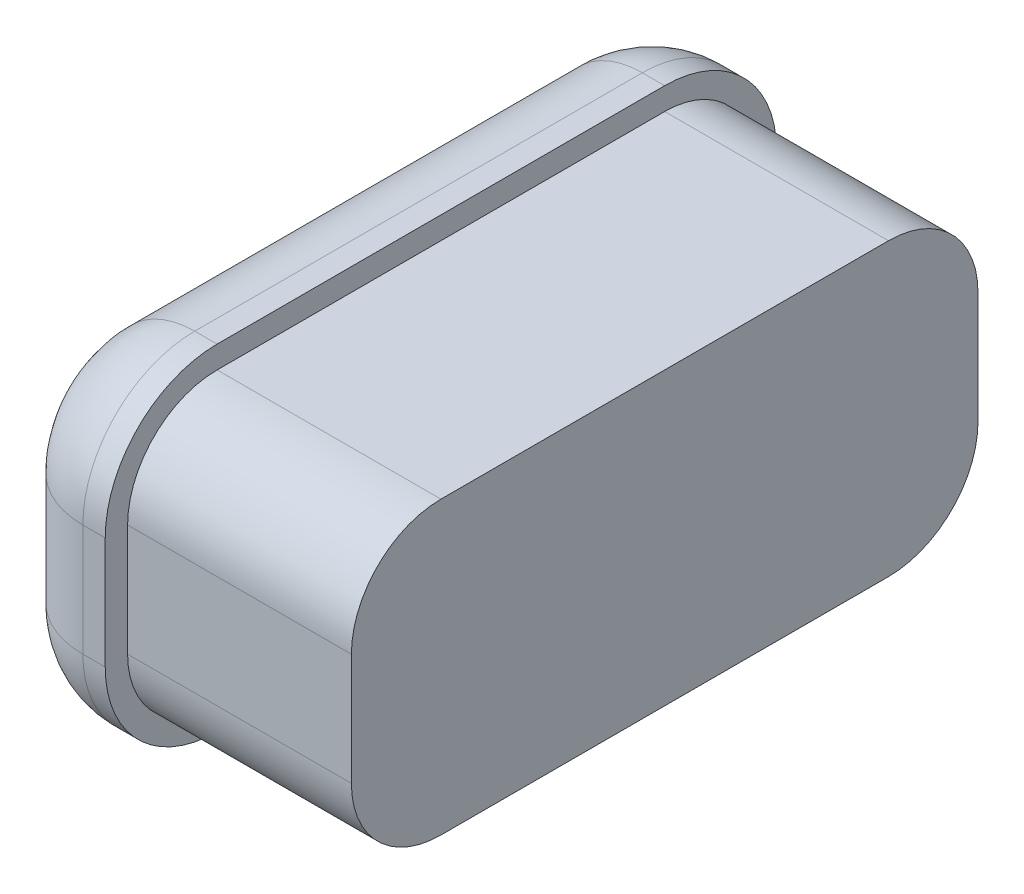
ISO-10303-21;
HEADER;
FILE_DESCRIPTION(('STEP AP214'),'2;1');
FILE_NAME('part.step','',(''),(''),'','','');
FILE_SCHEMA(('AUTOMOTIVE_DESIGN { 1 0 10303 214 1 1 1 1 }'));
ENDSEC;
DATA;
#1=APPLICATION_CONTEXT('core data for automotive mechanical design processes');
#2=APPLICATION_PROTOCOL_DEFINITION('international standard','automotive_design',2000,#1);
#3=PRODUCT_CONTEXT('',#1,'mechanical');
#4=PRODUCT('Part','Part','',(#3));
#5=PRODUCT_RELATED_PRODUCT_CATEGORY('part','',(#4));
#6=PRODUCT_DEFINITION_FORMATION('','',#4);
#7=PRODUCT_DEFINITION_CONTEXT('part definition',#1,'design');
#8=PRODUCT_DEFINITION('design','',#6,#7);
#9=PRODUCT_DEFINITION_SHAPE('','',#8);
#10=(LENGTH_UNIT() NAMED_UNIT(*) SI_UNIT(.MILLI.,.METRE.));
#11=(NAMED_UNIT(*) PLANE_ANGLE_UNIT() SI_UNIT($,.RADIAN.));
#12=(NAMED_UNIT(*) SI_UNIT($,.STERADIAN.) SOLID_ANGLE_UNIT());
#13=UNCERTAINTY_MEASURE_WITH_UNIT(LENGTH_MEASURE(1.E-05),#10,'distance_accuracy_value','');
#14=(GEOMETRIC_REPRESENTATION_CONTEXT(3) GLOBAL_UNCERTAINTY_ASSIGNED_CONTEXT((#13)) GLOBAL_UNIT_ASSIGNED_CONTEXT((#10,
#11,#12)) REPRESENTATION_CONTEXT('',''));
#15=CARTESIAN_POINT('',(0.,0.,0.));
#16=DIRECTION('',(0.,0.,1.));
#17=DIRECTION('',(1.,0.,0.));
#18=AXIS2_PLACEMENT_3D('',#15,#16,#17);
#19=CARTESIAN_POINT('',(5.,-7.5,15.));
#20=DIRECTION('',(0.,0.,-1.));
#21=DIRECTION('',(-1.,0.,0.));
#22=AXIS2_PLACEMENT_3D('',#19,#20,#21);
#23=PLANE('',#22);
#24=DIRECTION('',(-1.,0.,0.));
#25=VECTOR('',#24,1.);
#26=CARTESIAN_POINT('',(5.,2.5,15.));
#27=LINE('',#26,#25);
#28=CARTESIAN_POINT('',(5.,2.5,15.));
#29=VERTEX_POINT('',#28);
#30=CARTESIAN_POINT('',(4.,2.5,15.));
#31=VERTEX_POINT('',#30);
#32=EDGE_CURVE('E274',#29,#31,#27,.T.);
#33=ORIENTED_EDGE('',*,*,#32,.T.);
#34=DIRECTION('',(0.,-1.,0.));
#35=VECTOR('',#34,1.);
#36=CARTESIAN_POINT('',(4.,-7.5,15.));
#37=LINE('',#36,#35);
#38=CARTESIAN_POINT('',(4.,-2.5,15.));
#39=VERTEX_POINT('',#38);
#40=EDGE_CURVE('E299',#31,#39,#37,.T.);
#41=ORIENTED_EDGE('',*,*,#40,.T.);
#42=DIRECTION('',(-1.,0.,0.));
#43=VECTOR('',#42,1.);
#44=CARTESIAN_POINT('',(5.,-2.5,15.));
#45=LINE('',#44,#43);
#46=CARTESIAN_POINT('',(5.,-2.5,15.));
#47=VERTEX_POINT('',#46);
#48=EDGE_CURVE('E277',#39,#47,#45,.F.);
#49=ORIENTED_EDGE('',*,*,#48,.T.);
#50=DIRECTION('',(0.,-1.,0.));
#51=VECTOR('',#50,1.);
#52=CARTESIAN_POINT('',(5.,-7.5,15.));
#53=LINE('',#52,#51);
#54=EDGE_CURVE('E214',#29,#47,#53,.T.);
#55=ORIENTED_EDGE('',*,*,#54,.F.);
#56=EDGE_LOOP('',(#33,#41,#49,#55));
#57=FACE_BOUND('',#56,.T.);
#58=ADVANCED_FACE('F37',(#57),#23,.F.);
#59=CARTESIAN_POINT('',(5.,-7.5,-15.));
#60=DIRECTION('',(0.,1.,0.));
#61=DIRECTION('',(0.,0.,1.));
#62=AXIS2_PLACEMENT_3D('',#59,#60,#61);
#63=PLANE('',#62);
#64=DIRECTION('',(-1.,0.,0.));
#65=VECTOR('',#64,1.);
#66=CARTESIAN_POINT('',(5.,-7.5,10.));
#67=LINE('',#66,#65);
#68=CARTESIAN_POINT('',(5.,-7.5,10.));
#69=VERTEX_POINT('',#68);
#70=CARTESIAN_POINT('',(4.,-7.5,10.));
#71=VERTEX_POINT('',#70);
#72=EDGE_CURVE('E269',#69,#71,#67,.T.);
#73=ORIENTED_EDGE('',*,*,#72,.T.);
#74=DIRECTION('',(0.,0.,-1.));
#75=VECTOR('',#74,1.);
#76=CARTESIAN_POINT('',(4.,-7.5,-15.));
#77=LINE('',#76,#75);
#78=CARTESIAN_POINT('',(4.,-7.5,-10.));
#79=VERTEX_POINT('',#78);
#80=EDGE_CURVE('E303',#71,#79,#77,.T.);
#81=ORIENTED_EDGE('',*,*,#80,.T.);
#82=DIRECTION('',(-1.,0.,0.));
#83=VECTOR('',#82,1.);
#84=CARTESIAN_POINT('',(5.,-7.5,-10.));
#85=LINE('',#84,#83);
#86=CARTESIAN_POINT('',(5.,-7.5,-10.));
#87=VERTEX_POINT('',#86);
#88=EDGE_CURVE('E272',#79,#87,#85,.F.);
#89=ORIENTED_EDGE('',*,*,#88,.T.);
#90=DIRECTION('',(0.,0.,-1.));
#91=VECTOR('',#90,1.);
#92=CARTESIAN_POINT('',(5.,-7.5,-15.));
#93=LINE('',#92,#91);
#94=EDGE_CURVE('E217',#69,#87,#93,.T.);
#95=ORIENTED_EDGE('',*,*,#94,.F.);
#96=EDGE_LOOP('',(#73,#81,#89,#95));
#97=FACE_BOUND('',#96,.T.);
#98=ADVANCED_FACE('F377',(#97),#63,.F.);
#99=CARTESIAN_POINT('',(5.,-7.5,-15.));
#100=DIRECTION('',(0.,0.,1.));
#101=DIRECTION('',(1.,0.,0.));
#102=AXIS2_PLACEMENT_3D('',#99,#100,#101);
#103=PLANE('',#102);
#104=DIRECTION('',(-1.,0.,0.));
#105=VECTOR('',#104,1.);
#106=CARTESIAN_POINT('',(5.,-2.5,-15.));
#107=LINE('',#106,#105);
#108=CARTESIAN_POINT('',(5.,-2.5,-15.));
#109=VERTEX_POINT('',#108);
#110=CARTESIAN_POINT('',(4.,-2.5,-15.));
#111=VERTEX_POINT('',#110);
#112=EDGE_CURVE('E257',#109,#111,#107,.T.);
#113=ORIENTED_EDGE('',*,*,#112,.T.);
#114=DIRECTION('',(0.,1.,0.));
#115=VECTOR('',#114,1.);
#116=CARTESIAN_POINT('',(4.,-7.5,-15.));
#117=LINE('',#116,#115);
#118=CARTESIAN_POINT('',(4.,2.5,-15.));
#119=VERTEX_POINT('',#118);
#120=EDGE_CURVE('E61',#111,#119,#117,.T.);
#121=ORIENTED_EDGE('',*,*,#120,.T.);
#122=DIRECTION('',(-1.,0.,0.));
#123=VECTOR('',#122,1.);
#124=CARTESIAN_POINT('',(5.,2.5,-15.));
#125=LINE('',#124,#123);
#126=CARTESIAN_POINT('',(5.,2.5,-15.));
#127=VERTEX_POINT('',#126);
#128=EDGE_CURVE('E259',#119,#127,#125,.F.);
#129=ORIENTED_EDGE('',*,*,#128,.T.);
#130=DIRECTION('',(0.,1.,0.));
#131=VECTOR('',#130,1.);
#132=CARTESIAN_POINT('',(5.,-7.5,-15.));
#133=LINE('',#132,#131);
#134=EDGE_CURVE('E221',#109,#127,#133,.T.);
#135=ORIENTED_EDGE('',*,*,#134,.F.);
#136=EDGE_LOOP('',(#113,#121,#129,#135));
#137=FACE_BOUND('',#136,.T.);
#138=ADVANCED_FACE('F383',(#137),#103,.F.);
#139=CARTESIAN_POINT('',(5.,7.5,-15.));
#140=DIRECTION('',(0.,-1.,0.));
#141=DIRECTION('',(0.,0.,-1.));
#142=AXIS2_PLACEMENT_3D('',#139,#140,#141);
#143=PLANE('',#142);
#144=DIRECTION('',(-1.,0.,0.));
#145=VECTOR('',#144,1.);
#146=CARTESIAN_POINT('',(5.,7.5,-10.));
#147=LINE('',#146,#145);
#148=CARTESIAN_POINT('',(5.,7.5,-10.));
#149=VERTEX_POINT('',#148);
#150=CARTESIAN_POINT('',(4.,7.5,-10.));
#151=VERTEX_POINT('',#150);
#152=EDGE_CURVE('E255',#149,#151,#147,.T.);
#153=ORIENTED_EDGE('',*,*,#152,.T.);
#154=DIRECTION('',(0.,0.,1.));
#155=VECTOR('',#154,1.);
#156=CARTESIAN_POINT('',(4.,7.5,-15.));
#157=LINE('',#156,#155);
#158=CARTESIAN_POINT('',(4.,7.5,10.));
#159=VERTEX_POINT('',#158);
#160=EDGE_CURVE('E11',#151,#159,#157,.T.);
#161=ORIENTED_EDGE('',*,*,#160,.T.);
#162=DIRECTION('',(-1.,0.,0.));
#163=VECTOR('',#162,1.);
#164=CARTESIAN_POINT('',(5.,7.5,10.));
#165=LINE('',#164,#163);
#166=CARTESIAN_POINT('',(5.,7.5,10.));
#167=VERTEX_POINT('',#166);
#168=EDGE_CURVE('E253',#159,#167,#165,.F.);
#169=ORIENTED_EDGE('',*,*,#168,.T.);
#170=DIRECTION('',(0.,0.,1.));
#171=VECTOR('',#170,1.);
#172=CARTESIAN_POINT('',(5.,7.5,-15.));
#173=LINE('',#172,#171);
#174=EDGE_CURVE('E224',#149,#167,#173,.T.);
#175=ORIENTED_EDGE('',*,*,#174,.F.);
#176=EDGE_LOOP('',(#153,#161,#169,#175));
#177=FACE_BOUND('',#176,.T.);
#178=ADVANCED_FACE('F453',(#177),#143,.F.);
#179=CARTESIAN_POINT('',(5.,0.,0.));
#180=DIRECTION('',(1.,0.,0.));
#181=DIRECTION('',(0.,0.,-1.));
#182=AXIS2_PLACEMENT_3D('',#179,#180,#181);
#183=PLANE('',#182);
#184=DIRECTION('',(0.,-1.,0.));
#185=VECTOR('',#184,1.);
#186=CARTESIAN_POINT('',(5.,-6.5,14.));
#187=LINE('',#186,#185);
#188=CARTESIAN_POINT('',(5.,2.5,14.));
#189=VERTEX_POINT('',#188);
#190=CARTESIAN_POINT('',(5.,-2.5,14.));
#191=VERTEX_POINT('',#190);
#192=EDGE_CURVE('E210',#189,#191,#187,.T.);
#193=ORIENTED_EDGE('',*,*,#192,.F.);
#194=CARTESIAN_POINT('',(5.,2.5,10.));
#195=DIRECTION('',(1.,0.,0.));
#196=DIRECTION('',(0.,0.,-1.));
#197=AXIS2_PLACEMENT_3D('',#194,#195,#196);
#198=CIRCLE('',#197,4.);
#199=CARTESIAN_POINT('',(5.,6.5,10.));
#200=VERTEX_POINT('',#199);
#201=EDGE_CURVE('E251',#189,#200,#198,.F.);
#202=ORIENTED_EDGE('',*,*,#201,.T.);
#203=DIRECTION('',(0.,0.,1.));
#204=VECTOR('',#203,1.);
#205=CARTESIAN_POINT('',(5.,6.5,-14.));
#206=LINE('',#205,#204);
#207=CARTESIAN_POINT('',(5.,6.5,-10.));
#208=VERTEX_POINT('',#207);
#209=EDGE_CURVE('E204',#208,#200,#206,.T.);
#210=ORIENTED_EDGE('',*,*,#209,.F.);
#211=CARTESIAN_POINT('',(5.,2.5,-10.));
#212=DIRECTION('',(1.,0.,0.));
#213=DIRECTION('',(0.,0.,-1.));
#214=AXIS2_PLACEMENT_3D('',#211,#212,#213);
#215=CIRCLE('',#214,4.);
#216=CARTESIAN_POINT('',(5.,2.5,-14.));
#217=VERTEX_POINT('',#216);
#218=EDGE_CURVE('E186',#208,#217,#215,.F.);
#219=ORIENTED_EDGE('',*,*,#218,.T.);
#220=DIRECTION('',(0.,1.,0.));
#221=VECTOR('',#220,1.);
#222=CARTESIAN_POINT('',(5.,-6.5,-14.));
#223=LINE('',#222,#221);
#224=CARTESIAN_POINT('',(5.,-2.5,-14.));
#225=VERTEX_POINT('',#224);
#226=EDGE_CURVE('E193',#225,#217,#223,.T.);
#227=ORIENTED_EDGE('',*,*,#226,.F.);
#228=CARTESIAN_POINT('',(5.,-2.5,-10.));
#229=DIRECTION('',(1.,0.,0.));
#230=DIRECTION('',(0.,0.,-1.));
#231=AXIS2_PLACEMENT_3D('',#228,#229,#230);
#232=CIRCLE('',#231,4.);
#233=CARTESIAN_POINT('',(5.,-6.5,-10.));
#234=VERTEX_POINT('',#233);
#235=EDGE_CURVE('E176',#225,#234,#232,.F.);
#236=ORIENTED_EDGE('',*,*,#235,.T.);
#237=DIRECTION('',(0.,0.,-1.));
#238=VECTOR('',#237,1.);
#239=CARTESIAN_POINT('',(5.,-6.5,-14.));
#240=LINE('',#239,#238);
#241=CARTESIAN_POINT('',(5.,-6.5,10.));
#242=VERTEX_POINT('',#241);
#243=EDGE_CURVE('E205',#242,#234,#240,.T.);
#244=ORIENTED_EDGE('',*,*,#243,.F.);
#245=CARTESIAN_POINT('',(5.,-2.5,10.));
#246=DIRECTION('',(1.,0.,0.));
#247=DIRECTION('',(0.,0.,-1.));
#248=AXIS2_PLACEMENT_3D('',#245,#246,#247);
#249=CIRCLE('',#248,4.);
#250=EDGE_CURVE('E249',#242,#191,#249,.F.);
#251=ORIENTED_EDGE('',*,*,#250,.T.);
#252=EDGE_LOOP('',(#193,#202,#210,#219,#227,#236,#244,#251));
#253=FACE_BOUND('',#252,.T.);
#254=ORIENTED_EDGE('',*,*,#134,.T.);
#255=CARTESIAN_POINT('',(5.,2.5,-10.));
#256=DIRECTION('',(1.,0.,0.));
#257=DIRECTION('',(0.,0.,-1.));
#258=AXIS2_PLACEMENT_3D('',#255,#256,#257);
#259=CIRCLE('',#258,5.);
#260=EDGE_CURVE('E267',#127,#149,#259,.T.);
#261=ORIENTED_EDGE('',*,*,#260,.T.);
#262=ORIENTED_EDGE('',*,*,#174,.T.);
#263=CARTESIAN_POINT('',(5.,2.5,10.));
#264=DIRECTION('',(1.,0.,0.));
#265=DIRECTION('',(0.,0.,-1.));
#266=AXIS2_PLACEMENT_3D('',#263,#264,#265);
#267=CIRCLE('',#266,5.);
#268=EDGE_CURVE('E261',#167,#29,#267,.T.);
#269=ORIENTED_EDGE('',*,*,#268,.T.);
#270=ORIENTED_EDGE('',*,*,#54,.T.);
#271=CARTESIAN_POINT('',(5.,-2.5,10.));
#272=DIRECTION('',(1.,0.,0.));
#273=DIRECTION('',(0.,0.,-1.));
#274=AXIS2_PLACEMENT_3D('',#271,#272,#273);
#275=CIRCLE('',#274,5.);
#276=EDGE_CURVE('E263',#47,#69,#275,.T.);
#277=ORIENTED_EDGE('',*,*,#276,.T.);
#278=ORIENTED_EDGE('',*,*,#94,.T.);
#279=CARTESIAN_POINT('',(5.,-2.5,-10.));
#280=DIRECTION('',(1.,0.,0.));
#281=DIRECTION('',(0.,0.,-1.));
#282=AXIS2_PLACEMENT_3D('',#279,#280,#281);
#283=CIRCLE('',#282,5.);
#284=EDGE_CURVE('E265',#87,#109,#283,.T.);
#285=ORIENTED_EDGE('',*,*,#284,.T.);
#286=EDGE_LOOP('',(#254,#261,#262,#269,#270,#277,#278,#285));
#287=FACE_BOUND('',#286,.T.);
#288=ADVANCED_FACE('F201',(#253,#287),#183,.T.);
#289=CARTESIAN_POINT('',(0.,0.,0.));
#290=DIRECTION('',(1.,0.,0.));
#291=DIRECTION('',(0.,0.,-1.));
#292=AXIS2_PLACEMENT_3D('',#289,#290,#291);
#293=PLANE('',#292);
#294=DIRECTION('',(0.,-1.,0.));
#295=VECTOR('',#294,1.);
#296=CARTESIAN_POINT('',(0.,0.,11.));
#297=LINE('',#296,#295);
#298=CARTESIAN_POINT('',(0.,-2.5,11.));
#299=VERTEX_POINT('',#298);
#300=CARTESIAN_POINT('',(0.,2.5,11.));
#301=VERTEX_POINT('',#300);
#302=EDGE_CURVE('E291',#299,#301,#297,.F.);
#303=ORIENTED_EDGE('',*,*,#302,.T.);
#304=CARTESIAN_POINT('',(0.,2.5,10.));
#305=DIRECTION('',(1.,0.,0.));
#306=DIRECTION('',(0.,0.,-1.));
#307=AXIS2_PLACEMENT_3D('',#304,#305,#306);
#308=CIRCLE('',#307,1.);
#309=CARTESIAN_POINT('',(0.,3.5,10.));
#310=VERTEX_POINT('',#309);
#311=EDGE_CURVE('E293',#301,#310,#308,.F.);
#312=ORIENTED_EDGE('',*,*,#311,.T.);
#313=DIRECTION('',(0.,0.,1.));
#314=VECTOR('',#313,1.);
#315=CARTESIAN_POINT('',(0.,3.5,0.));
#316=LINE('',#315,#314);
#317=CARTESIAN_POINT('',(0.,3.5,-10.));
#318=VERTEX_POINT('',#317);
#319=EDGE_CURVE('E279',#310,#318,#316,.F.);
#320=ORIENTED_EDGE('',*,*,#319,.T.);
#321=CARTESIAN_POINT('',(0.,2.5,-10.));
#322=DIRECTION('',(1.,0.,0.));
#323=DIRECTION('',(0.,0.,-1.));
#324=AXIS2_PLACEMENT_3D('',#321,#322,#323);
#325=CIRCLE('',#324,1.);
#326=CARTESIAN_POINT('',(0.,2.5,-11.));
#327=VERTEX_POINT('',#326);
#328=EDGE_CURVE('E281',#318,#327,#325,.F.);
#329=ORIENTED_EDGE('',*,*,#328,.T.);
#330=DIRECTION('',(0.,1.,0.));
#331=VECTOR('',#330,1.);
#332=CARTESIAN_POINT('',(0.,0.,-11.));
#333=LINE('',#332,#331);
#334=CARTESIAN_POINT('',(0.,-2.5,-11.));
#335=VERTEX_POINT('',#334);
#336=EDGE_CURVE('E283',#327,#335,#333,.F.);
#337=ORIENTED_EDGE('',*,*,#336,.T.);
#338=CARTESIAN_POINT('',(0.,-2.5,-10.));
#339=DIRECTION('',(1.,0.,0.));
#340=DIRECTION('',(0.,0.,-1.));
#341=AXIS2_PLACEMENT_3D('',#338,#339,#340);
#342=CIRCLE('',#341,1.);
#343=CARTESIAN_POINT('',(0.,-3.5,-10.));
#344=VERTEX_POINT('',#343);
#345=EDGE_CURVE('E285',#335,#344,#342,.F.);
#346=ORIENTED_EDGE('',*,*,#345,.T.);
#347=DIRECTION('',(0.,0.,-1.));
#348=VECTOR('',#347,1.);
#349=CARTESIAN_POINT('',(0.,-3.5,0.));
#350=LINE('',#349,#348);
#351=CARTESIAN_POINT('',(0.,-3.5,10.));
#352=VERTEX_POINT('',#351);
#353=EDGE_CURVE('E287',#344,#352,#350,.F.);
#354=ORIENTED_EDGE('',*,*,#353,.T.);
#355=CARTESIAN_POINT('',(0.,-2.5,10.));
#356=DIRECTION('',(1.,0.,0.));
#357=DIRECTION('',(0.,0.,-1.));
#358=AXIS2_PLACEMENT_3D('',#355,#356,#357);
#359=CIRCLE('',#358,1.);
#360=EDGE_CURVE('E289',#352,#299,#359,.F.);
#361=ORIENTED_EDGE('',*,*,#360,.T.);
#362=EDGE_LOOP('',(#303,#312,#320,#329,#337,#346,#354,#361));
#363=FACE_BOUND('',#362,.T.);
#364=ADVANCED_FACE('F366',(#363),#293,.F.);
#365=CARTESIAN_POINT('',(15.,-6.5,14.));
#366=DIRECTION('',(0.,0.,-1.));
#367=DIRECTION('',(-1.,0.,0.));
#368=AXIS2_PLACEMENT_3D('',#365,#366,#367);
#369=PLANE('',#368);
#370=ORIENTED_EDGE('',*,*,#192,.T.);
#371=DIRECTION('',(-1.,0.,0.));
#372=VECTOR('',#371,1.);
#373=CARTESIAN_POINT('',(15.,-2.5,14.));
#374=LINE('',#373,#372);
#375=CARTESIAN_POINT('',(15.,-2.5,14.));
#376=VERTEX_POINT('',#375);
#377=EDGE_CURVE('E187',#191,#376,#374,.F.);
#378=ORIENTED_EDGE('',*,*,#377,.T.);
#379=DIRECTION('',(0.,-1.,0.));
#380=VECTOR('',#379,1.);
#381=CARTESIAN_POINT('',(15.,-6.5,14.));
#382=LINE('',#381,#380);
#383=CARTESIAN_POINT('',(15.,2.5,14.));
#384=VERTEX_POINT('',#383);
#385=EDGE_CURVE('E208',#384,#376,#382,.T.);
#386=ORIENTED_EDGE('',*,*,#385,.F.);
#387=DIRECTION('',(-1.,0.,0.));
#388=VECTOR('',#387,1.);
#389=CARTESIAN_POINT('',(15.,2.5,14.));
#390=LINE('',#389,#388);
#391=EDGE_CURVE('E244',#384,#189,#390,.T.);
#392=ORIENTED_EDGE('',*,*,#391,.T.);
#393=EDGE_LOOP('',(#370,#378,#386,#392));
#394=FACE_BOUND('',#393,.T.);
#395=ADVANCED_FACE('F364',(#394),#369,.F.);
#396=CARTESIAN_POINT('',(15.,-6.5,-14.));
#397=DIRECTION('',(0.,1.,0.));
#398=DIRECTION('',(0.,0.,1.));
#399=AXIS2_PLACEMENT_3D('',#396,#397,#398);
#400=PLANE('',#399);
#401=ORIENTED_EDGE('',*,*,#243,.T.);
#402=DIRECTION('',(-1.,0.,0.));
#403=VECTOR('',#402,1.);
#404=CARTESIAN_POINT('',(15.,-6.5,-10.));
#405=LINE('',#404,#403);
#406=CARTESIAN_POINT('',(15.,-6.5,-10.));
#407=VERTEX_POINT('',#406);
#408=EDGE_CURVE('E181',#234,#407,#405,.F.);
#409=ORIENTED_EDGE('',*,*,#408,.T.);
#410=DIRECTION('',(0.,0.,-1.));
#411=VECTOR('',#410,1.);
#412=CARTESIAN_POINT('',(15.,-6.5,-14.));
#413=LINE('',#412,#411);
#414=CARTESIAN_POINT('',(15.,-6.5,10.));
#415=VERTEX_POINT('',#414);
#416=EDGE_CURVE('E341',#415,#407,#413,.T.);
#417=ORIENTED_EDGE('',*,*,#416,.F.);
#418=DIRECTION('',(-1.,0.,0.));
#419=VECTOR('',#418,1.);
#420=CARTESIAN_POINT('',(15.,-6.5,10.));
#421=LINE('',#420,#419);
#422=EDGE_CURVE('E197',#415,#242,#421,.T.);
#423=ORIENTED_EDGE('',*,*,#422,.T.);
#424=EDGE_LOOP('',(#401,#409,#417,#423));
#425=FACE_BOUND('',#424,.T.);
#426=ADVANCED_FACE('F356',(#425),#400,.F.);
#427=CARTESIAN_POINT('',(15.,-6.5,-14.));
#428=DIRECTION('',(0.,0.,1.));
#429=DIRECTION('',(1.,0.,0.));
#430=AXIS2_PLACEMENT_3D('',#427,#428,#429);
#431=PLANE('',#430);
#432=DIRECTION('',(0.,1.,0.));
#433=VECTOR('',#432,1.);
#434=CARTESIAN_POINT('',(15.,-6.5,-14.));
#435=LINE('',#434,#433);
#436=CARTESIAN_POINT('',(15.,-2.5,-14.));
#437=VERTEX_POINT('',#436);
#438=CARTESIAN_POINT('',(15.,2.5,-14.));
#439=VERTEX_POINT('',#438);
#440=EDGE_CURVE('E196',#437,#439,#435,.T.);
#441=ORIENTED_EDGE('',*,*,#440,.F.);
#442=DIRECTION('',(-1.,0.,0.));
#443=VECTOR('',#442,1.);
#444=CARTESIAN_POINT('',(15.,-2.5,-14.));
#445=LINE('',#444,#443);
#446=EDGE_CURVE('E180',#437,#225,#445,.T.);
#447=ORIENTED_EDGE('',*,*,#446,.T.);
#448=ORIENTED_EDGE('',*,*,#226,.T.);
#449=DIRECTION('',(-1.,0.,0.));
#450=VECTOR('',#449,1.);
#451=CARTESIAN_POINT('',(15.,2.5,-14.));
#452=LINE('',#451,#450);
#453=EDGE_CURVE('E198',#217,#439,#452,.F.);
#454=ORIENTED_EDGE('',*,*,#453,.T.);
#455=EDGE_LOOP('',(#441,#447,#448,#454));
#456=FACE_BOUND('',#455,.T.);
#457=ADVANCED_FACE('F192',(#456),#431,.F.);
#458=CARTESIAN_POINT('',(15.,6.5,-14.));
#459=DIRECTION('',(0.,-1.,0.));
#460=DIRECTION('',(0.,0.,-1.));
#461=AXIS2_PLACEMENT_3D('',#458,#459,#460);
#462=PLANE('',#461);
#463=DIRECTION('',(0.,0.,1.));
#464=VECTOR('',#463,1.);
#465=CARTESIAN_POINT('',(15.,6.5,-14.));
#466=LINE('',#465,#464);
#467=CARTESIAN_POINT('',(15.,6.5,-10.));
#468=VERTEX_POINT('',#467);
#469=CARTESIAN_POINT('',(15.,6.5,10.));
#470=VERTEX_POINT('',#469);
#471=EDGE_CURVE('E218',#468,#470,#466,.T.);
#472=ORIENTED_EDGE('',*,*,#471,.F.);
#473=DIRECTION('',(-1.,0.,0.));
#474=VECTOR('',#473,1.);
#475=CARTESIAN_POINT('',(15.,6.5,-10.));
#476=LINE('',#475,#474);
#477=EDGE_CURVE('E241',#468,#208,#476,.T.);
#478=ORIENTED_EDGE('',*,*,#477,.T.);
#479=ORIENTED_EDGE('',*,*,#209,.T.);
#480=DIRECTION('',(-1.,0.,0.));
#481=VECTOR('',#480,1.);
#482=CARTESIAN_POINT('',(15.,6.5,10.));
#483=LINE('',#482,#481);
#484=EDGE_CURVE('E239',#200,#470,#483,.F.);
#485=ORIENTED_EDGE('',*,*,#484,.T.);
#486=EDGE_LOOP('',(#472,#478,#479,#485));
#487=FACE_BOUND('',#486,.T.);
#488=ADVANCED_FACE('F361',(#487),#462,.F.);
#489=CARTESIAN_POINT('',(15.,0.,0.));
#490=DIRECTION('',(1.,0.,0.));
#491=DIRECTION('',(0.,0.,-1.));
#492=AXIS2_PLACEMENT_3D('',#489,#490,#491);
#493=PLANE('',#492);
#494=ORIENTED_EDGE('',*,*,#416,.T.);
#495=CARTESIAN_POINT('',(15.,-2.5,-10.));
#496=DIRECTION('',(1.,0.,0.));
#497=DIRECTION('',(0.,0.,-1.));
#498=AXIS2_PLACEMENT_3D('',#495,#496,#497);
#499=CIRCLE('',#498,4.);
#500=EDGE_CURVE('E237',#407,#437,#499,.T.);
#501=ORIENTED_EDGE('',*,*,#500,.T.);
#502=ORIENTED_EDGE('',*,*,#440,.T.);
#503=CARTESIAN_POINT('',(15.,2.5,-10.));
#504=DIRECTION('',(1.,0.,0.));
#505=DIRECTION('',(0.,0.,-1.));
#506=AXIS2_PLACEMENT_3D('',#503,#504,#505);
#507=CIRCLE('',#506,4.);
#508=EDGE_CURVE('E235',#439,#468,#507,.T.);
#509=ORIENTED_EDGE('',*,*,#508,.T.);
#510=ORIENTED_EDGE('',*,*,#471,.T.);
#511=CARTESIAN_POINT('',(15.,2.5,10.));
#512=DIRECTION('',(1.,0.,0.));
#513=DIRECTION('',(0.,0.,-1.));
#514=AXIS2_PLACEMENT_3D('',#511,#512,#513);
#515=CIRCLE('',#514,4.);
#516=EDGE_CURVE('E231',#470,#384,#515,.T.);
#517=ORIENTED_EDGE('',*,*,#516,.T.);
#518=ORIENTED_EDGE('',*,*,#385,.T.);
#519=CARTESIAN_POINT('',(15.,-2.5,10.));
#520=DIRECTION('',(1.,0.,0.));
#521=DIRECTION('',(0.,0.,-1.));
#522=AXIS2_PLACEMENT_3D('',#519,#520,#521);
#523=CIRCLE('',#522,4.);
#524=EDGE_CURVE('E233',#376,#415,#523,.T.);
#525=ORIENTED_EDGE('',*,*,#524,.T.);
#526=EDGE_LOOP('',(#494,#501,#502,#509,#510,#517,#518,#525));
#527=FACE_BOUND('',#526,.T.);
#528=ADVANCED_FACE('F348',(#527),#493,.T.);
#529=CARTESIAN_POINT('',(15.,-2.5,-10.));
#530=DIRECTION('',(-1.,0.,0.));
#531=DIRECTION('',(0.,0.,1.));
#532=AXIS2_PLACEMENT_3D('',#529,#530,#531);
#533=CYLINDRICAL_SURFACE('',#532,4.);
#534=ORIENTED_EDGE('',*,*,#500,.F.);
#535=ORIENTED_EDGE('',*,*,#408,.F.);
#536=ORIENTED_EDGE('',*,*,#235,.F.);
#537=ORIENTED_EDGE('',*,*,#446,.F.);
#538=EDGE_LOOP('',(#534,#535,#536,#537));
#539=FACE_BOUND('',#538,.T.);
#540=ADVANCED_FACE('F179',(#539),#533,.T.);
#541=CARTESIAN_POINT('',(15.,2.5,-10.));
#542=DIRECTION('',(-1.,0.,0.));
#543=DIRECTION('',(0.,0.,1.));
#544=AXIS2_PLACEMENT_3D('',#541,#542,#543);
#545=CYLINDRICAL_SURFACE('',#544,4.);
#546=ORIENTED_EDGE('',*,*,#508,.F.);
#547=ORIENTED_EDGE('',*,*,#453,.F.);
#548=ORIENTED_EDGE('',*,*,#218,.F.);
#549=ORIENTED_EDGE('',*,*,#477,.F.);
#550=EDGE_LOOP('',(#546,#547,#548,#549));
#551=FACE_BOUND('',#550,.T.);
#552=ADVANCED_FACE('F390',(#551),#545,.T.);
#553=CARTESIAN_POINT('',(15.,-2.5,10.));
#554=DIRECTION('',(-1.,0.,0.));
#555=DIRECTION('',(0.,0.,1.));
#556=AXIS2_PLACEMENT_3D('',#553,#554,#555);
#557=CYLINDRICAL_SURFACE('',#556,4.);
#558=ORIENTED_EDGE('',*,*,#524,.F.);
#559=ORIENTED_EDGE('',*,*,#377,.F.);
#560=ORIENTED_EDGE('',*,*,#250,.F.);
#561=ORIENTED_EDGE('',*,*,#422,.F.);
#562=EDGE_LOOP('',(#558,#559,#560,#561));
#563=FACE_BOUND('',#562,.T.);
#564=ADVANCED_FACE('F354',(#563),#557,.T.);
#565=CARTESIAN_POINT('',(15.,2.5,10.));
#566=DIRECTION('',(-1.,0.,0.));
#567=DIRECTION('',(0.,0.,1.));
#568=AXIS2_PLACEMENT_3D('',#565,#566,#567);
#569=CYLINDRICAL_SURFACE('',#568,4.);
#570=ORIENTED_EDGE('',*,*,#516,.F.);
#571=ORIENTED_EDGE('',*,*,#484,.F.);
#572=ORIENTED_EDGE('',*,*,#201,.F.);
#573=ORIENTED_EDGE('',*,*,#391,.F.);
#574=EDGE_LOOP('',(#570,#571,#572,#573));
#575=FACE_BOUND('',#574,.T.);
#576=ADVANCED_FACE('F363',(#575),#569,.T.);
#577=CARTESIAN_POINT('',(5.,2.5,-10.));
#578=DIRECTION('',(-1.,0.,0.));
#579=DIRECTION('',(0.,0.,1.));
#580=AXIS2_PLACEMENT_3D('',#577,#578,#579);
#581=CYLINDRICAL_SURFACE('',#580,5.);
#582=ORIENTED_EDGE('',*,*,#128,.F.);
#583=CARTESIAN_POINT('',(4.,2.5,-10.));
#584=DIRECTION('',(1.,0.,0.));
#585=DIRECTION('',(0.,0.,-1.));
#586=AXIS2_PLACEMENT_3D('',#583,#584,#585);
#587=CIRCLE('',#586,5.);
#588=EDGE_CURVE('E46',#119,#151,#587,.T.);
#589=ORIENTED_EDGE('',*,*,#588,.T.);
#590=ORIENTED_EDGE('',*,*,#152,.F.);
#591=ORIENTED_EDGE('',*,*,#260,.F.);
#592=EDGE_LOOP('',(#582,#589,#590,#591));
#593=FACE_BOUND('',#592,.T.);
#594=ADVANCED_FACE('F398',(#593),#581,.T.);
#595=CARTESIAN_POINT('',(5.,-2.5,-10.));
#596=DIRECTION('',(-1.,0.,0.));
#597=DIRECTION('',(0.,0.,1.));
#598=AXIS2_PLACEMENT_3D('',#595,#596,#597);
#599=CYLINDRICAL_SURFACE('',#598,5.);
#600=ORIENTED_EDGE('',*,*,#88,.F.);
#601=CARTESIAN_POINT('',(4.,-2.5,-10.));
#602=DIRECTION('',(1.,0.,0.));
#603=DIRECTION('',(0.,0.,-1.));
#604=AXIS2_PLACEMENT_3D('',#601,#602,#603);
#605=CIRCLE('',#604,5.);
#606=EDGE_CURVE('E305',#79,#111,#605,.T.);
#607=ORIENTED_EDGE('',*,*,#606,.T.);
#608=ORIENTED_EDGE('',*,*,#112,.F.);
#609=ORIENTED_EDGE('',*,*,#284,.F.);
#610=EDGE_LOOP('',(#600,#607,#608,#609));
#611=FACE_BOUND('',#610,.T.);
#612=ADVANCED_FACE('F401',(#611),#599,.T.);
#613=CARTESIAN_POINT('',(5.,-2.5,10.));
#614=DIRECTION('',(-1.,0.,0.));
#615=DIRECTION('',(0.,0.,1.));
#616=AXIS2_PLACEMENT_3D('',#613,#614,#615);
#617=CYLINDRICAL_SURFACE('',#616,5.);
#618=ORIENTED_EDGE('',*,*,#48,.F.);
#619=CARTESIAN_POINT('',(4.,-2.5,10.));
#620=DIRECTION('',(1.,0.,0.));
#621=DIRECTION('',(0.,0.,-1.));
#622=AXIS2_PLACEMENT_3D('',#619,#620,#621);
#623=CIRCLE('',#622,5.);
#624=EDGE_CURVE('E301',#39,#71,#623,.T.);
#625=ORIENTED_EDGE('',*,*,#624,.T.);
#626=ORIENTED_EDGE('',*,*,#72,.F.);
#627=ORIENTED_EDGE('',*,*,#276,.F.);
#628=EDGE_LOOP('',(#618,#625,#626,#627));
#629=FACE_BOUND('',#628,.T.);
#630=ADVANCED_FACE('F404',(#629),#617,.T.);
#631=CARTESIAN_POINT('',(5.,2.5,10.));
#632=DIRECTION('',(-1.,0.,0.));
#633=DIRECTION('',(0.,0.,1.));
#634=AXIS2_PLACEMENT_3D('',#631,#632,#633);
#635=CYLINDRICAL_SURFACE('',#634,5.);
#636=ORIENTED_EDGE('',*,*,#168,.F.);
#637=CARTESIAN_POINT('',(4.,2.5,10.));
#638=DIRECTION('',(1.,0.,0.));
#639=DIRECTION('',(0.,0.,-1.));
#640=AXIS2_PLACEMENT_3D('',#637,#638,#639);
#641=CIRCLE('',#640,5.);
#642=EDGE_CURVE('E296',#159,#31,#641,.T.);
#643=ORIENTED_EDGE('',*,*,#642,.T.);
#644=ORIENTED_EDGE('',*,*,#32,.F.);
#645=ORIENTED_EDGE('',*,*,#268,.F.);
#646=EDGE_LOOP('',(#636,#643,#644,#645));
#647=FACE_BOUND('',#646,.T.);
#648=ADVANCED_FACE('F408',(#647),#635,.T.);
#649=CARTESIAN_POINT('',(4.,-2.5,-10.));
#650=DIRECTION('',(1.,0.,0.));
#651=DIRECTION('',(0.,0.,-1.));
#652=AXIS2_PLACEMENT_3D('',#649,#650,#651);
#653=DEGENERATE_TOROIDAL_SURFACE('',#652,1.,4.,.T.);
#654=CARTESIAN_POINT('',(4.,-2.5,-11.));
#655=DIRECTION('',(0.,1.,0.));
#656=DIRECTION('',(0.,0.,1.));
#657=AXIS2_PLACEMENT_3D('',#654,#655,#656);
#658=CIRCLE('',#657,4.);
#659=EDGE_CURVE('E324',#111,#335,#658,.T.);
#660=ORIENTED_EDGE('',*,*,#659,.F.);
#661=ORIENTED_EDGE('',*,*,#606,.F.);
#662=CARTESIAN_POINT('',(4.,-3.5,-10.));
#663=DIRECTION('',(0.,0.,1.));
#664=DIRECTION('',(1.,0.,0.));
#665=AXIS2_PLACEMENT_3D('',#662,#663,#664);
#666=CIRCLE('',#665,4.);
#667=EDGE_CURVE('E41',#344,#79,#666,.T.);
#668=ORIENTED_EDGE('',*,*,#667,.F.);
#669=ORIENTED_EDGE('',*,*,#345,.F.);
#670=EDGE_LOOP('',(#660,#661,#668,#669));
#671=FACE_BOUND('',#670,.T.);
#672=ADVANCED_FACE('F39',(#671),#653,.T.);
#673=CARTESIAN_POINT('',(4.,-3.5,-15.));
#674=DIRECTION('',(0.,0.,-1.));
#675=DIRECTION('',(0.,1.,0.));
#676=AXIS2_PLACEMENT_3D('',#673,#674,#675);
#677=CYLINDRICAL_SURFACE('',#676,4.);
#678=ORIENTED_EDGE('',*,*,#667,.T.);
#679=ORIENTED_EDGE('',*,*,#80,.F.);
#680=CARTESIAN_POINT('',(4.,-3.5,10.));
#681=DIRECTION('',(0.,0.,1.));
#682=DIRECTION('',(1.,0.,0.));
#683=AXIS2_PLACEMENT_3D('',#680,#681,#682);
#684=CIRCLE('',#683,4.);
#685=EDGE_CURVE('E322',#352,#71,#684,.T.);
#686=ORIENTED_EDGE('',*,*,#685,.F.);
#687=ORIENTED_EDGE('',*,*,#353,.F.);
#688=EDGE_LOOP('',(#678,#679,#686,#687));
#689=FACE_BOUND('',#688,.T.);
#690=ADVANCED_FACE('F435',(#689),#677,.T.);
#691=CARTESIAN_POINT('',(4.,-7.5,-11.));
#692=DIRECTION('',(0.,1.,0.));
#693=DIRECTION('',(0.,0.,1.));
#694=AXIS2_PLACEMENT_3D('',#691,#692,#693);
#695=CYLINDRICAL_SURFACE('',#694,4.);
#696=ORIENTED_EDGE('',*,*,#659,.T.);
#697=ORIENTED_EDGE('',*,*,#336,.F.);
#698=CARTESIAN_POINT('',(4.,2.5,-11.));
#699=DIRECTION('',(0.,1.,0.));
#700=DIRECTION('',(0.,0.,1.));
#701=AXIS2_PLACEMENT_3D('',#698,#699,#700);
#702=CIRCLE('',#701,4.);
#703=EDGE_CURVE('E319',#119,#327,#702,.T.);
#704=ORIENTED_EDGE('',*,*,#703,.F.);
#705=ORIENTED_EDGE('',*,*,#120,.F.);
#706=EDGE_LOOP('',(#696,#697,#704,#705));
#707=FACE_BOUND('',#706,.T.);
#708=ADVANCED_FACE('F432',(#707),#695,.T.);
#709=CARTESIAN_POINT('',(4.,-2.5,10.));
#710=DIRECTION('',(1.,0.,0.));
#711=DIRECTION('',(0.,0.,-1.));
#712=AXIS2_PLACEMENT_3D('',#709,#710,#711);
#713=DEGENERATE_TOROIDAL_SURFACE('',#712,1.,4.,.T.);
#714=ORIENTED_EDGE('',*,*,#685,.T.);
#715=ORIENTED_EDGE('',*,*,#624,.F.);
#716=CARTESIAN_POINT('',(4.,-2.5,11.));
#717=DIRECTION('',(0.,1.,0.));
#718=DIRECTION('',(0.,0.,1.));
#719=AXIS2_PLACEMENT_3D('',#716,#717,#718);
#720=CIRCLE('',#719,4.);
#721=EDGE_CURVE('E316',#299,#39,#720,.T.);
#722=ORIENTED_EDGE('',*,*,#721,.F.);
#723=ORIENTED_EDGE('',*,*,#360,.F.);
#724=EDGE_LOOP('',(#714,#715,#722,#723));
#725=FACE_BOUND('',#724,.T.);
#726=ADVANCED_FACE('F428',(#725),#713,.T.);
#727=CARTESIAN_POINT('',(4.,2.5,-10.));
#728=DIRECTION('',(1.,0.,0.));
#729=DIRECTION('',(0.,0.,-1.));
#730=AXIS2_PLACEMENT_3D('',#727,#728,#729);
#731=DEGENERATE_TOROIDAL_SURFACE('',#730,1.,4.,.T.);
#732=ORIENTED_EDGE('',*,*,#703,.T.);
#733=ORIENTED_EDGE('',*,*,#328,.F.);
#734=CARTESIAN_POINT('',(4.,3.5,-10.));
#735=DIRECTION('',(0.,0.,1.));
#736=DIRECTION('',(1.,0.,0.));
#737=AXIS2_PLACEMENT_3D('',#734,#735,#736);
#738=CIRCLE('',#737,4.);
#739=EDGE_CURVE('E313',#151,#318,#738,.T.);
#740=ORIENTED_EDGE('',*,*,#739,.F.);
#741=ORIENTED_EDGE('',*,*,#588,.F.);
#742=EDGE_LOOP('',(#732,#733,#740,#741));
#743=FACE_BOUND('',#742,.T.);
#744=ADVANCED_FACE('F424',(#743),#731,.T.);
#745=CARTESIAN_POINT('',(4.,-7.5,11.));
#746=DIRECTION('',(0.,-1.,0.));
#747=DIRECTION('',(0.,0.,-1.));
#748=AXIS2_PLACEMENT_3D('',#745,#746,#747);
#749=CYLINDRICAL_SURFACE('',#748,4.);
#750=ORIENTED_EDGE('',*,*,#721,.T.);
#751=ORIENTED_EDGE('',*,*,#40,.F.);
#752=CARTESIAN_POINT('',(4.,2.5,11.));
#753=DIRECTION('',(0.,1.,0.));
#754=DIRECTION('',(0.,0.,1.));
#755=AXIS2_PLACEMENT_3D('',#752,#753,#754);
#756=CIRCLE('',#755,4.);
#757=EDGE_CURVE('E311',#301,#31,#756,.T.);
#758=ORIENTED_EDGE('',*,*,#757,.F.);
#759=ORIENTED_EDGE('',*,*,#302,.F.);
#760=EDGE_LOOP('',(#750,#751,#758,#759));
#761=FACE_BOUND('',#760,.T.);
#762=ADVANCED_FACE('F420',(#761),#749,.T.);
#763=CARTESIAN_POINT('',(4.,3.5,-15.));
#764=DIRECTION('',(0.,0.,1.));
#765=DIRECTION('',(0.,-1.,0.));
#766=AXIS2_PLACEMENT_3D('',#763,#764,#765);
#767=CYLINDRICAL_SURFACE('',#766,4.);
#768=ORIENTED_EDGE('',*,*,#739,.T.);
#769=ORIENTED_EDGE('',*,*,#319,.F.);
#770=CARTESIAN_POINT('',(4.,3.5,10.));
#771=DIRECTION('',(0.,0.,1.));
#772=DIRECTION('',(1.,0.,0.));
#773=AXIS2_PLACEMENT_3D('',#770,#771,#772);
#774=CIRCLE('',#773,4.);
#775=EDGE_CURVE('E309',#159,#310,#774,.T.);
#776=ORIENTED_EDGE('',*,*,#775,.F.);
#777=ORIENTED_EDGE('',*,*,#160,.F.);
#778=EDGE_LOOP('',(#768,#769,#776,#777));
#779=FACE_BOUND('',#778,.T.);
#780=ADVANCED_FACE('F416',(#779),#767,.T.);
#781=CARTESIAN_POINT('',(4.,2.5,10.));
#782=DIRECTION('',(1.,0.,0.));
#783=DIRECTION('',(0.,0.,-1.));
#784=AXIS2_PLACEMENT_3D('',#781,#782,#783);
#785=DEGENERATE_TOROIDAL_SURFACE('',#784,1.,4.,.T.);
#786=ORIENTED_EDGE('',*,*,#757,.T.);
#787=ORIENTED_EDGE('',*,*,#642,.F.);
#788=ORIENTED_EDGE('',*,*,#775,.T.);
#789=ORIENTED_EDGE('',*,*,#311,.F.);
#790=EDGE_LOOP('',(#786,#787,#788,#789));
#791=FACE_BOUND('',#790,.T.);
#792=ADVANCED_FACE('F413',(#791),#785,.T.);
#793=CLOSED_SHELL('',(#58,#98,#138,#178,#288,#364,#395,#426,#457,#488,#528,#540,#552,#564,#576,
#594,#612,#630,#648,#672,#690,#708,#726,#744,#762,#780,#792));
#794=MANIFOLD_SOLID_BREP('B2',#793);
#795=ADVANCED_BREP_SHAPE_REPRESENTATION('',(#18,#794),#14);
#796=SHAPE_DEFINITION_REPRESENTATION(#9,#795);
ENDSEC;
END-ISO-10303-21;
